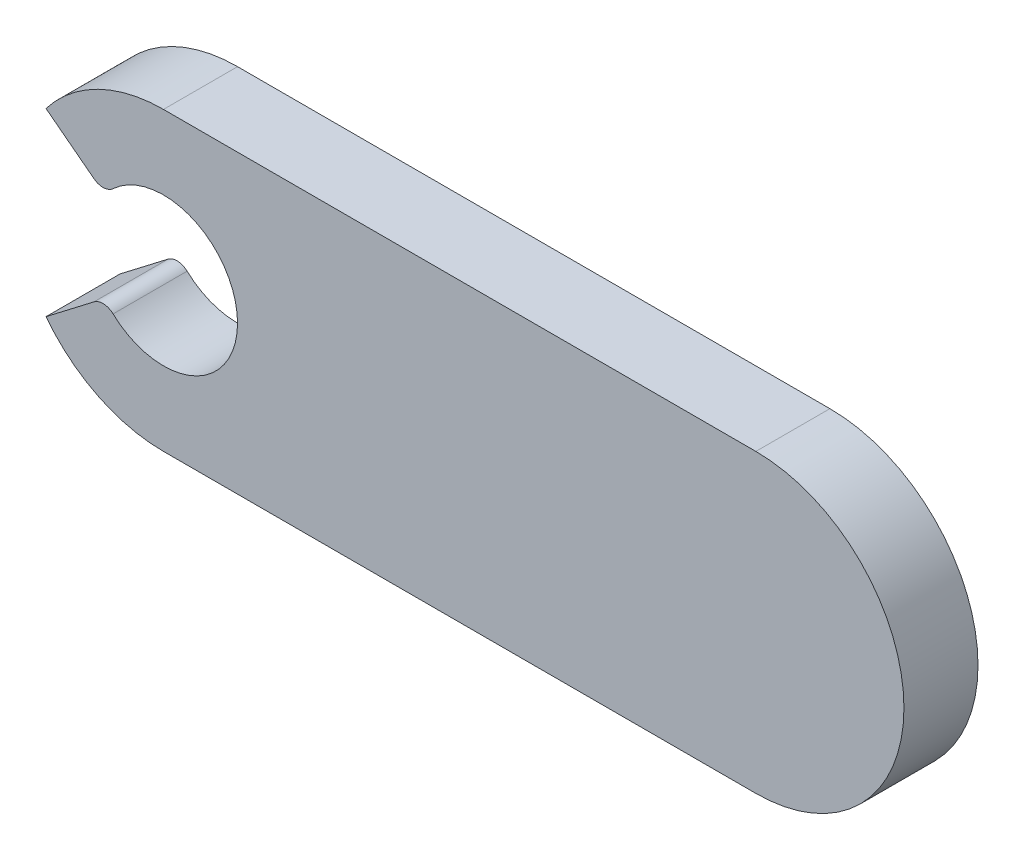
ISO-10303-21;
HEADER;
FILE_DESCRIPTION(('STEP AP214'),'2;1');
FILE_NAME('part.step','',(''),(''),'','','');
FILE_SCHEMA(('AUTOMOTIVE_DESIGN { 1 0 10303 214 1 1 1 1 }'));
ENDSEC;
DATA;
#1=APPLICATION_CONTEXT('core data for automotive mechanical design processes');
#2=APPLICATION_PROTOCOL_DEFINITION('international standard','automotive_design',2000,#1);
#3=PRODUCT_CONTEXT('',#1,'mechanical');
#4=PRODUCT('Part','Part','',(#3));
#5=PRODUCT_RELATED_PRODUCT_CATEGORY('part','',(#4));
#6=PRODUCT_DEFINITION_FORMATION('','',#4);
#7=PRODUCT_DEFINITION_CONTEXT('part definition',#1,'design');
#8=PRODUCT_DEFINITION('design','',#6,#7);
#9=PRODUCT_DEFINITION_SHAPE('','',#8);
#10=(LENGTH_UNIT() NAMED_UNIT(*) SI_UNIT(.MILLI.,.METRE.));
#11=(NAMED_UNIT(*) PLANE_ANGLE_UNIT() SI_UNIT($,.RADIAN.));
#12=(NAMED_UNIT(*) SI_UNIT($,.STERADIAN.) SOLID_ANGLE_UNIT());
#13=UNCERTAINTY_MEASURE_WITH_UNIT(LENGTH_MEASURE(1.E-05),#10,'distance_accuracy_value','');
#14=(GEOMETRIC_REPRESENTATION_CONTEXT(3) GLOBAL_UNCERTAINTY_ASSIGNED_CONTEXT((#13)) GLOBAL_UNIT_ASSIGNED_CONTEXT((#10,
#11,#12)) REPRESENTATION_CONTEXT('',''));
#15=CARTESIAN_POINT('',(0.,0.,0.));
#16=DIRECTION('',(0.,0.,1.));
#17=DIRECTION('',(1.,0.,0.));
#18=AXIS2_PLACEMENT_3D('',#15,#16,#17);
#19=CARTESIAN_POINT('',(0.,0.,2.5));
#20=DIRECTION('',(0.,0.,-1.));
#21=DIRECTION('',(-1.,0.,0.));
#22=AXIS2_PLACEMENT_3D('',#19,#20,#21);
#23=CYLINDRICAL_SURFACE('',#22,5.);
#24=CARTESIAN_POINT('',(0.,0.,0.));
#25=DIRECTION('',(0.,0.,1.));
#26=DIRECTION('',(-1.,0.,0.));
#27=AXIS2_PLACEMENT_3D('',#24,#25,#26);
#28=CIRCLE('',#27,5.);
#29=CARTESIAN_POINT('',(0.,5.,0.));
#30=VERTEX_POINT('',#29);
#31=CARTESIAN_POINT('',(-3.96676670145618,3.04380714504359,0.));
#32=VERTEX_POINT('',#31);
#33=EDGE_CURVE('E138',#30,#32,#28,.T.);
#34=ORIENTED_EDGE('',*,*,#33,.T.);
#35=DIRECTION('',(0.,0.,-1.));
#36=VECTOR('',#35,1.);
#37=CARTESIAN_POINT('',(-3.96676670145618,3.04380714504359,2.5));
#38=LINE('',#37,#36);
#39=CARTESIAN_POINT('',(-3.96676670145618,3.04380714504359,2.5));
#40=VERTEX_POINT('',#39);
#41=EDGE_CURVE('E122',#40,#32,#38,.T.);
#42=ORIENTED_EDGE('',*,*,#41,.F.);
#43=CARTESIAN_POINT('',(0.,0.,2.5));
#44=DIRECTION('',(0.,0.,1.));
#45=DIRECTION('',(-1.,0.,0.));
#46=AXIS2_PLACEMENT_3D('',#43,#44,#45);
#47=CIRCLE('',#46,5.);
#48=CARTESIAN_POINT('',(0.,5.,2.5));
#49=VERTEX_POINT('',#48);
#50=EDGE_CURVE('E126',#49,#40,#47,.T.);
#51=ORIENTED_EDGE('',*,*,#50,.F.);
#52=DIRECTION('',(0.,0.,-1.));
#53=VECTOR('',#52,1.);
#54=CARTESIAN_POINT('',(0.,5.,2.5));
#55=LINE('',#54,#53);
#56=EDGE_CURVE('E185',#49,#30,#55,.T.);
#57=ORIENTED_EDGE('',*,*,#56,.T.);
#58=EDGE_LOOP('',(#34,#42,#51,#57));
#59=FACE_BOUND('',#58,.T.);
#60=ADVANCED_FACE('F41',(#59),#23,.T.);
#61=CARTESIAN_POINT('',(-3.96676670145618,3.04380714504359,2.5));
#62=DIRECTION('',(0.60876142900872,0.793353340291236,0.));
#63=DIRECTION('',(-0.793353340291236,0.60876142900872,0.));
#64=AXIS2_PLACEMENT_3D('',#61,#62,#63);
#65=PLANE('',#64);
#66=DIRECTION('',(0.793353340291236,-0.60876142900872,0.));
#67=VECTOR('',#66,1.);
#68=CARTESIAN_POINT('',(-3.96676670145618,3.04380714504359,0.));
#69=LINE('',#68,#67);
#70=CARTESIAN_POINT('',(-2.34677082867577,1.80074059144465,0.));
#71=VERTEX_POINT('',#70);
#72=EDGE_CURVE('E169',#32,#71,#69,.T.);
#73=ORIENTED_EDGE('',*,*,#72,.T.);
#74=DIRECTION('',(0.,0.,-1.));
#75=VECTOR('',#74,1.);
#76=CARTESIAN_POINT('',(-2.34677082867577,1.80074059144465,2.5));
#77=LINE('',#76,#75);
#78=CARTESIAN_POINT('',(-2.34677082867577,1.80074059144465,2.5));
#79=VERTEX_POINT('',#78);
#80=EDGE_CURVE('E64',#71,#79,#77,.F.);
#81=ORIENTED_EDGE('',*,*,#80,.T.);
#82=DIRECTION('',(0.793353340291236,-0.60876142900872,0.));
#83=VECTOR('',#82,1.);
#84=CARTESIAN_POINT('',(-3.96676670145618,3.04380714504359,2.5));
#85=LINE('',#84,#83);
#86=EDGE_CURVE('E118',#40,#79,#85,.T.);
#87=ORIENTED_EDGE('',*,*,#86,.F.);
#88=ORIENTED_EDGE('',*,*,#41,.T.);
#89=EDGE_LOOP('',(#73,#81,#87,#88));
#90=FACE_BOUND('',#89,.T.);
#91=ADVANCED_FACE('F120',(#90),#65,.F.);
#92=CARTESIAN_POINT('',(0.,0.,2.5));
#93=DIRECTION('',(0.,0.,-1.));
#94=DIRECTION('',(-1.,0.,0.));
#95=AXIS2_PLACEMENT_3D('',#92,#93,#94);
#96=CYLINDRICAL_SURFACE('',#95,2.5);
#97=CARTESIAN_POINT('',(0.,0.,2.5));
#98=DIRECTION('',(0.,0.,-1.));
#99=DIRECTION('',(-1.,0.,0.));
#100=AXIS2_PLACEMENT_3D('',#97,#98,#99);
#101=CIRCLE('',#100,2.5);
#102=CARTESIAN_POINT('',(-1.70199176180951,1.83118105132523,2.5));
#103=VERTEX_POINT('',#102);
#104=CARTESIAN_POINT('',(-1.70199176180951,-1.83118105132523,2.5));
#105=VERTEX_POINT('',#104);
#106=EDGE_CURVE('E125',#103,#105,#101,.T.);
#107=ORIENTED_EDGE('',*,*,#106,.F.);
#108=DIRECTION('',(0.,0.,-1.));
#109=VECTOR('',#108,1.);
#110=CARTESIAN_POINT('',(-1.70199176180951,1.83118105132523,2.5));
#111=LINE('',#110,#109);
#112=CARTESIAN_POINT('',(-1.70199176180951,1.83118105132523,0.));
#113=VERTEX_POINT('',#112);
#114=EDGE_CURVE('E142',#103,#113,#111,.T.);
#115=ORIENTED_EDGE('',*,*,#114,.T.);
#116=CARTESIAN_POINT('',(0.,0.,0.));
#117=DIRECTION('',(0.,0.,-1.));
#118=DIRECTION('',(-1.,0.,0.));
#119=AXIS2_PLACEMENT_3D('',#116,#117,#118);
#120=CIRCLE('',#119,2.5);
#121=CARTESIAN_POINT('',(-1.70199176180951,-1.83118105132523,0.));
#122=VERTEX_POINT('',#121);
#123=EDGE_CURVE('E170',#113,#122,#120,.T.);
#124=ORIENTED_EDGE('',*,*,#123,.T.);
#125=DIRECTION('',(0.,0.,-1.));
#126=VECTOR('',#125,1.);
#127=CARTESIAN_POINT('',(-1.70199176180951,-1.83118105132523,2.5));
#128=LINE('',#127,#126);
#129=EDGE_CURVE('E139',#122,#105,#128,.F.);
#130=ORIENTED_EDGE('',*,*,#129,.T.);
#131=EDGE_LOOP('',(#107,#115,#124,#130));
#132=FACE_BOUND('',#131,.T.);
#133=ADVANCED_FACE('F160',(#132),#96,.F.);
#134=CARTESIAN_POINT('',(-1.98338335072809,-1.52190357252179,2.5));
#135=DIRECTION('',(0.60876142900872,-0.793353340291236,0.));
#136=DIRECTION('',(0.793353340291236,0.60876142900872,0.));
#137=AXIS2_PLACEMENT_3D('',#134,#135,#136);
#138=PLANE('',#137);
#139=DIRECTION('',(-0.793353340291236,-0.60876142900872,0.));
#140=VECTOR('',#139,1.);
#141=CARTESIAN_POINT('',(-1.98338335072809,-1.52190357252179,2.5));
#142=LINE('',#141,#140);
#143=CARTESIAN_POINT('',(-2.34677082867577,-1.80074059144465,2.5));
#144=VERTEX_POINT('',#143);
#145=CARTESIAN_POINT('',(-3.96676670145618,-3.04380714504359,2.5));
#146=VERTEX_POINT('',#145);
#147=EDGE_CURVE('E164',#144,#146,#142,.T.);
#148=ORIENTED_EDGE('',*,*,#147,.F.);
#149=DIRECTION('',(0.,0.,-1.));
#150=VECTOR('',#149,1.);
#151=CARTESIAN_POINT('',(-2.34677082867577,-1.80074059144465,2.5));
#152=LINE('',#151,#150);
#153=CARTESIAN_POINT('',(-2.34677082867577,-1.80074059144465,0.));
#154=VERTEX_POINT('',#153);
#155=EDGE_CURVE('E11',#144,#154,#152,.T.);
#156=ORIENTED_EDGE('',*,*,#155,.T.);
#157=DIRECTION('',(-0.793353340291236,-0.60876142900872,0.));
#158=VECTOR('',#157,1.);
#159=CARTESIAN_POINT('',(-1.98338335072809,-1.52190357252179,0.));
#160=LINE('',#159,#158);
#161=CARTESIAN_POINT('',(-3.96676670145618,-3.04380714504359,0.));
#162=VERTEX_POINT('',#161);
#163=EDGE_CURVE('E172',#154,#162,#160,.T.);
#164=ORIENTED_EDGE('',*,*,#163,.T.);
#165=DIRECTION('',(0.,0.,-1.));
#166=VECTOR('',#165,1.);
#167=CARTESIAN_POINT('',(-3.96676670145618,-3.04380714504359,2.5));
#168=LINE('',#167,#166);
#169=EDGE_CURVE('E140',#146,#162,#168,.T.);
#170=ORIENTED_EDGE('',*,*,#169,.F.);
#171=EDGE_LOOP('',(#148,#156,#164,#170));
#172=FACE_BOUND('',#171,.T.);
#173=ADVANCED_FACE('F221',(#172),#138,.F.);
#174=CARTESIAN_POINT('',(0.,0.,2.5));
#175=DIRECTION('',(0.,0.,-1.));
#176=DIRECTION('',(-1.,0.,0.));
#177=AXIS2_PLACEMENT_3D('',#174,#175,#176);
#178=CYLINDRICAL_SURFACE('',#177,5.);
#179=CARTESIAN_POINT('',(0.,0.,0.));
#180=DIRECTION('',(0.,0.,1.));
#181=DIRECTION('',(-1.,0.,0.));
#182=AXIS2_PLACEMENT_3D('',#179,#180,#181);
#183=CIRCLE('',#182,5.);
#184=CARTESIAN_POINT('',(0.,-5.,0.));
#185=VERTEX_POINT('',#184);
#186=EDGE_CURVE('E178',#162,#185,#183,.T.);
#187=ORIENTED_EDGE('',*,*,#186,.T.);
#188=DIRECTION('',(0.,0.,-1.));
#189=VECTOR('',#188,1.);
#190=CARTESIAN_POINT('',(0.,-5.,2.5));
#191=LINE('',#190,#189);
#192=CARTESIAN_POINT('',(0.,-5.,2.5));
#193=VERTEX_POINT('',#192);
#194=EDGE_CURVE('E145',#193,#185,#191,.T.);
#195=ORIENTED_EDGE('',*,*,#194,.F.);
#196=CARTESIAN_POINT('',(0.,0.,2.5));
#197=DIRECTION('',(0.,0.,1.));
#198=DIRECTION('',(-1.,0.,0.));
#199=AXIS2_PLACEMENT_3D('',#196,#197,#198);
#200=CIRCLE('',#199,5.);
#201=EDGE_CURVE('E216',#146,#193,#200,.T.);
#202=ORIENTED_EDGE('',*,*,#201,.F.);
#203=ORIENTED_EDGE('',*,*,#169,.T.);
#204=EDGE_LOOP('',(#187,#195,#202,#203));
#205=FACE_BOUND('',#204,.T.);
#206=ADVANCED_FACE('F222',(#205),#178,.T.);
#207=CARTESIAN_POINT('',(20.,-5.,2.5));
#208=DIRECTION('',(0.,1.,0.));
#209=DIRECTION('',(-1.,0.,0.));
#210=AXIS2_PLACEMENT_3D('',#207,#208,#209);
#211=PLANE('',#210);
#212=DIRECTION('',(1.,0.,0.));
#213=VECTOR('',#212,1.);
#214=CARTESIAN_POINT('',(20.,-5.,0.));
#215=LINE('',#214,#213);
#216=CARTESIAN_POINT('',(20.,-5.,0.));
#217=VERTEX_POINT('',#216);
#218=EDGE_CURVE('E180',#185,#217,#215,.T.);
#219=ORIENTED_EDGE('',*,*,#218,.T.);
#220=DIRECTION('',(0.,0.,-1.));
#221=VECTOR('',#220,1.);
#222=CARTESIAN_POINT('',(20.,-5.,2.5));
#223=LINE('',#222,#221);
#224=CARTESIAN_POINT('',(20.,-5.,2.5));
#225=VERTEX_POINT('',#224);
#226=EDGE_CURVE('E190',#225,#217,#223,.T.);
#227=ORIENTED_EDGE('',*,*,#226,.F.);
#228=DIRECTION('',(1.,0.,0.));
#229=VECTOR('',#228,1.);
#230=CARTESIAN_POINT('',(20.,-5.,2.5));
#231=LINE('',#230,#229);
#232=EDGE_CURVE('E199',#193,#225,#231,.T.);
#233=ORIENTED_EDGE('',*,*,#232,.F.);
#234=ORIENTED_EDGE('',*,*,#194,.T.);
#235=EDGE_LOOP('',(#219,#227,#233,#234));
#236=FACE_BOUND('',#235,.T.);
#237=ADVANCED_FACE('F197',(#236),#211,.F.);
#238=CARTESIAN_POINT('',(20.,0.,2.5));
#239=DIRECTION('',(0.,0.,-1.));
#240=DIRECTION('',(-1.,0.,0.));
#241=AXIS2_PLACEMENT_3D('',#238,#239,#240);
#242=CYLINDRICAL_SURFACE('',#241,5.);
#243=CARTESIAN_POINT('',(20.,0.,0.));
#244=DIRECTION('',(0.,0.,1.));
#245=DIRECTION('',(-1.,0.,0.));
#246=AXIS2_PLACEMENT_3D('',#243,#244,#245);
#247=CIRCLE('',#246,5.);
#248=CARTESIAN_POINT('',(20.,5.,0.));
#249=VERTEX_POINT('',#248);
#250=EDGE_CURVE('E182',#217,#249,#247,.T.);
#251=ORIENTED_EDGE('',*,*,#250,.T.);
#252=DIRECTION('',(0.,0.,-1.));
#253=VECTOR('',#252,1.);
#254=CARTESIAN_POINT('',(20.,5.,2.5));
#255=LINE('',#254,#253);
#256=CARTESIAN_POINT('',(20.,5.,2.5));
#257=VERTEX_POINT('',#256);
#258=EDGE_CURVE('E187',#257,#249,#255,.T.);
#259=ORIENTED_EDGE('',*,*,#258,.F.);
#260=CARTESIAN_POINT('',(20.,0.,2.5));
#261=DIRECTION('',(0.,0.,1.));
#262=DIRECTION('',(-1.,0.,0.));
#263=AXIS2_PLACEMENT_3D('',#260,#261,#262);
#264=CIRCLE('',#263,5.);
#265=EDGE_CURVE('E212',#225,#257,#264,.T.);
#266=ORIENTED_EDGE('',*,*,#265,.F.);
#267=ORIENTED_EDGE('',*,*,#226,.T.);
#268=EDGE_LOOP('',(#251,#259,#266,#267));
#269=FACE_BOUND('',#268,.T.);
#270=ADVANCED_FACE('F208',(#269),#242,.T.);
#271=CARTESIAN_POINT('',(0.,5.,2.5));
#272=DIRECTION('',(0.,-1.,0.));
#273=DIRECTION('',(1.,0.,0.));
#274=AXIS2_PLACEMENT_3D('',#271,#272,#273);
#275=PLANE('',#274);
#276=DIRECTION('',(-1.,0.,0.));
#277=VECTOR('',#276,1.);
#278=CARTESIAN_POINT('',(0.,5.,0.));
#279=LINE('',#278,#277);
#280=EDGE_CURVE('E135',#249,#30,#279,.T.);
#281=ORIENTED_EDGE('',*,*,#280,.T.);
#282=ORIENTED_EDGE('',*,*,#56,.F.);
#283=DIRECTION('',(-1.,0.,0.));
#284=VECTOR('',#283,1.);
#285=CARTESIAN_POINT('',(0.,5.,2.5));
#286=LINE('',#285,#284);
#287=EDGE_CURVE('E131',#257,#49,#286,.T.);
#288=ORIENTED_EDGE('',*,*,#287,.F.);
#289=ORIENTED_EDGE('',*,*,#258,.T.);
#290=EDGE_LOOP('',(#281,#282,#288,#289));
#291=FACE_BOUND('',#290,.T.);
#292=ADVANCED_FACE('F211',(#291),#275,.F.);
#293=CARTESIAN_POINT('',(0.,0.,2.5));
#294=DIRECTION('',(0.,0.,-1.));
#295=DIRECTION('',(-1.,0.,0.));
#296=AXIS2_PLACEMENT_3D('',#293,#294,#295);
#297=PLANE('',#296);
#298=ORIENTED_EDGE('',*,*,#86,.T.);
#299=CARTESIAN_POINT('',(-2.04239011417141,2.19741726159027,2.5));
#300=DIRECTION('',(0.,0.,-1.));
#301=DIRECTION('',(-1.,0.,0.));
#302=AXIS2_PLACEMENT_3D('',#299,#300,#301);
#303=CIRCLE('',#302,0.5);
#304=EDGE_CURVE('E49',#79,#103,#303,.F.);
#305=ORIENTED_EDGE('',*,*,#304,.T.);
#306=ORIENTED_EDGE('',*,*,#106,.T.);
#307=CARTESIAN_POINT('',(-2.04239011417141,-2.19741726159027,2.5));
#308=DIRECTION('',(0.,0.,-1.));
#309=DIRECTION('',(-1.,0.,0.));
#310=AXIS2_PLACEMENT_3D('',#307,#308,#309);
#311=CIRCLE('',#310,0.5);
#312=EDGE_CURVE('E56',#105,#144,#311,.F.);
#313=ORIENTED_EDGE('',*,*,#312,.T.);
#314=ORIENTED_EDGE('',*,*,#147,.T.);
#315=ORIENTED_EDGE('',*,*,#201,.T.);
#316=ORIENTED_EDGE('',*,*,#232,.T.);
#317=ORIENTED_EDGE('',*,*,#265,.T.);
#318=ORIENTED_EDGE('',*,*,#287,.T.);
#319=ORIENTED_EDGE('',*,*,#50,.T.);
#320=EDGE_LOOP('',(#298,#305,#306,#313,#314,#315,#316,#317,#318,#319));
#321=FACE_BOUND('',#320,.T.);
#322=ADVANCED_FACE('F129',(#321),#297,.F.);
#323=CARTESIAN_POINT('',(0.,0.,0.));
#324=DIRECTION('',(0.,0.,-1.));
#325=DIRECTION('',(-1.,0.,0.));
#326=AXIS2_PLACEMENT_3D('',#323,#324,#325);
#327=PLANE('',#326);
#328=ORIENTED_EDGE('',*,*,#123,.F.);
#329=CARTESIAN_POINT('',(-2.04239011417141,2.19741726159027,0.));
#330=DIRECTION('',(0.,0.,-1.));
#331=DIRECTION('',(-1.,0.,0.));
#332=AXIS2_PLACEMENT_3D('',#329,#330,#331);
#333=CIRCLE('',#332,0.5);
#334=EDGE_CURVE('E153',#113,#71,#333,.T.);
#335=ORIENTED_EDGE('',*,*,#334,.T.);
#336=ORIENTED_EDGE('',*,*,#72,.F.);
#337=ORIENTED_EDGE('',*,*,#33,.F.);
#338=ORIENTED_EDGE('',*,*,#280,.F.);
#339=ORIENTED_EDGE('',*,*,#250,.F.);
#340=ORIENTED_EDGE('',*,*,#218,.F.);
#341=ORIENTED_EDGE('',*,*,#186,.F.);
#342=ORIENTED_EDGE('',*,*,#163,.F.);
#343=CARTESIAN_POINT('',(-2.04239011417141,-2.19741726159027,0.));
#344=DIRECTION('',(0.,0.,-1.));
#345=DIRECTION('',(-1.,0.,0.));
#346=AXIS2_PLACEMENT_3D('',#343,#344,#345);
#347=CIRCLE('',#346,0.5);
#348=EDGE_CURVE('E151',#154,#122,#347,.T.);
#349=ORIENTED_EDGE('',*,*,#348,.T.);
#350=EDGE_LOOP('',(#328,#335,#336,#337,#338,#339,#340,#341,#342,#349));
#351=FACE_BOUND('',#350,.T.);
#352=ADVANCED_FACE('F168',(#351),#327,.T.);
#353=CARTESIAN_POINT('',(-2.04239011417141,2.19741726159027,2.5));
#354=DIRECTION('',(0.,0.,-1.));
#355=DIRECTION('',(-1.,0.,0.));
#356=AXIS2_PLACEMENT_3D('',#353,#354,#355);
#357=CYLINDRICAL_SURFACE('',#356,0.5);
#358=ORIENTED_EDGE('',*,*,#304,.F.);
#359=ORIENTED_EDGE('',*,*,#80,.F.);
#360=ORIENTED_EDGE('',*,*,#334,.F.);
#361=ORIENTED_EDGE('',*,*,#114,.F.);
#362=EDGE_LOOP('',(#358,#359,#360,#361));
#363=FACE_BOUND('',#362,.T.);
#364=ADVANCED_FACE('F166',(#363),#357,.T.);
#365=CARTESIAN_POINT('',(-2.04239011417141,-2.19741726159027,2.5));
#366=DIRECTION('',(0.,0.,-1.));
#367=DIRECTION('',(-1.,0.,0.));
#368=AXIS2_PLACEMENT_3D('',#365,#366,#367);
#369=CYLINDRICAL_SURFACE('',#368,0.5);
#370=ORIENTED_EDGE('',*,*,#312,.F.);
#371=ORIENTED_EDGE('',*,*,#129,.F.);
#372=ORIENTED_EDGE('',*,*,#348,.F.);
#373=ORIENTED_EDGE('',*,*,#155,.F.);
#374=EDGE_LOOP('',(#370,#371,#372,#373));
#375=FACE_BOUND('',#374,.T.);
#376=ADVANCED_FACE('F43',(#375),#369,.T.);
#377=CLOSED_SHELL('',(#60,#91,#133,#173,#206,#237,#270,#292,#322,#352,#364,#376));
#378=MANIFOLD_SOLID_BREP('B2',#377);
#379=ADVANCED_BREP_SHAPE_REPRESENTATION('',(#18,#378),#14);
#380=SHAPE_DEFINITION_REPRESENTATION(#9,#379);
ENDSEC;
END-ISO-10303-21;
